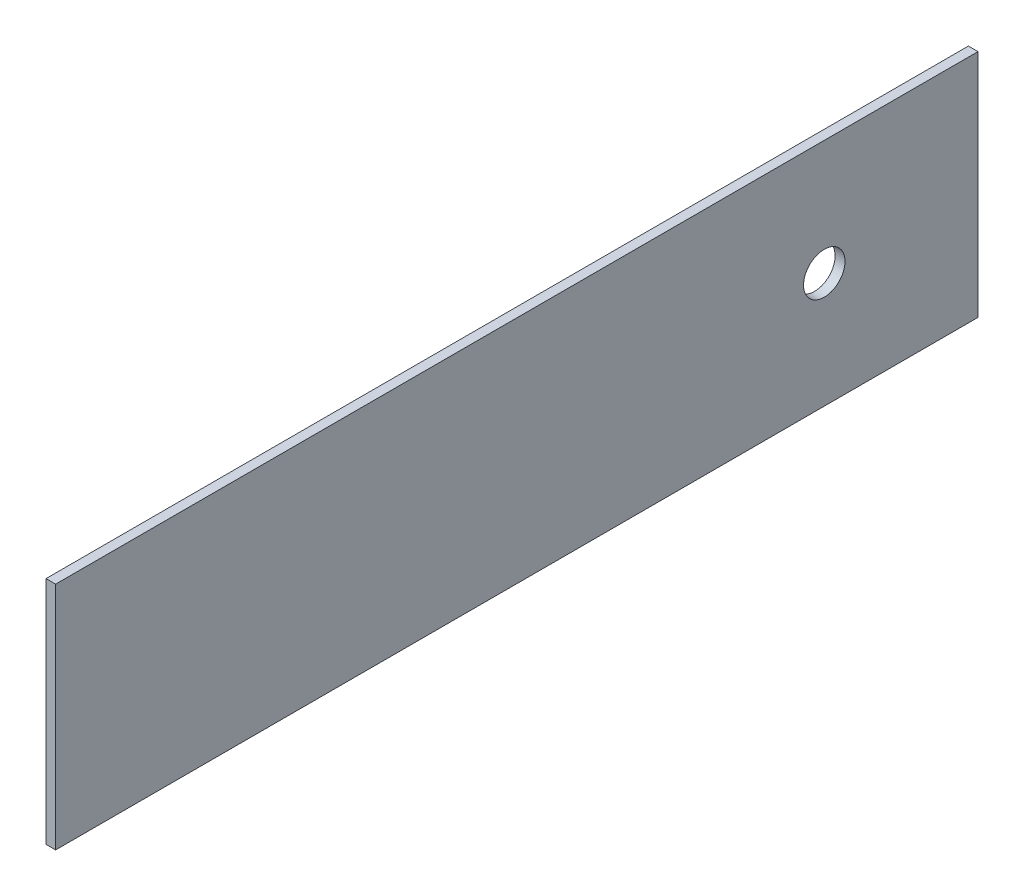
ISO-10303-21;
HEADER;
FILE_DESCRIPTION(('STEP AP214'),'2;1');
FILE_NAME('part.step','',(''),(''),'','','');
FILE_SCHEMA(('AUTOMOTIVE_DESIGN { 1 0 10303 214 1 1 1 1 }'));
ENDSEC;
DATA;
#1=APPLICATION_CONTEXT('core data for automotive mechanical design processes');
#2=APPLICATION_PROTOCOL_DEFINITION('international standard','automotive_design',2000,#1);
#3=PRODUCT_CONTEXT('',#1,'mechanical');
#4=PRODUCT('Part','Part','',(#3));
#5=PRODUCT_RELATED_PRODUCT_CATEGORY('part','',(#4));
#6=PRODUCT_DEFINITION_FORMATION('','',#4);
#7=PRODUCT_DEFINITION_CONTEXT('part definition',#1,'design');
#8=PRODUCT_DEFINITION('design','',#6,#7);
#9=PRODUCT_DEFINITION_SHAPE('','',#8);
#10=(LENGTH_UNIT() NAMED_UNIT(*) SI_UNIT(.MILLI.,.METRE.));
#11=(NAMED_UNIT(*) PLANE_ANGLE_UNIT() SI_UNIT($,.RADIAN.));
#12=(NAMED_UNIT(*) SI_UNIT($,.STERADIAN.) SOLID_ANGLE_UNIT());
#13=UNCERTAINTY_MEASURE_WITH_UNIT(LENGTH_MEASURE(1.E-05),#10,'distance_accuracy_value','');
#14=(GEOMETRIC_REPRESENTATION_CONTEXT(3) GLOBAL_UNCERTAINTY_ASSIGNED_CONTEXT((#13)) GLOBAL_UNIT_ASSIGNED_CONTEXT((#10,
#11,#12)) REPRESENTATION_CONTEXT('',''));
#15=CARTESIAN_POINT('',(0.,0.,0.));
#16=DIRECTION('',(0.,0.,1.));
#17=DIRECTION('',(1.,0.,0.));
#18=AXIS2_PLACEMENT_3D('',#15,#16,#17);
#19=CARTESIAN_POINT('',(3.175,0.,0.));
#20=DIRECTION('',(0.,0.,-1.));
#21=DIRECTION('',(0.,1.,0.));
#22=AXIS2_PLACEMENT_3D('',#19,#20,#21);
#23=PLANE('',#22);
#24=DIRECTION('',(0.,-1.,0.));
#25=VECTOR('',#24,1.);
#26=CARTESIAN_POINT('',(0.,0.,0.));
#27=LINE('',#26,#25);
#28=CARTESIAN_POINT('',(0.,0.,0.));
#29=VERTEX_POINT('',#28);
#30=CARTESIAN_POINT('',(0.,-76.073,0.));
#31=VERTEX_POINT('',#30);
#32=EDGE_CURVE('E96',#29,#31,#27,.T.);
#33=ORIENTED_EDGE('',*,*,#32,.T.);
#34=DIRECTION('',(-1.,0.,0.));
#35=VECTOR('',#34,1.);
#36=CARTESIAN_POINT('',(3.175,-76.073,0.));
#37=LINE('',#36,#35);
#38=CARTESIAN_POINT('',(3.175,-76.073,0.));
#39=VERTEX_POINT('',#38);
#40=EDGE_CURVE('E11',#39,#31,#37,.T.);
#41=ORIENTED_EDGE('',*,*,#40,.F.);
#42=DIRECTION('',(0.,-1.,0.));
#43=VECTOR('',#42,1.);
#44=CARTESIAN_POINT('',(3.175,0.,0.));
#45=LINE('',#44,#43);
#46=CARTESIAN_POINT('',(3.175,0.,0.));
#47=VERTEX_POINT('',#46);
#48=EDGE_CURVE('E84',#47,#39,#45,.T.);
#49=ORIENTED_EDGE('',*,*,#48,.F.);
#50=DIRECTION('',(-1.,0.,0.));
#51=VECTOR('',#50,1.);
#52=CARTESIAN_POINT('',(3.175,0.,0.));
#53=LINE('',#52,#51);
#54=EDGE_CURVE('E92',#47,#29,#53,.T.);
#55=ORIENTED_EDGE('',*,*,#54,.T.);
#56=EDGE_LOOP('',(#33,#41,#49,#55));
#57=FACE_BOUND('',#56,.T.);
#58=ADVANCED_FACE('F33',(#57),#23,.F.);
#59=CARTESIAN_POINT('',(3.175,-76.073,0.));
#60=DIRECTION('',(0.,1.,0.));
#61=DIRECTION('',(0.,0.,1.));
#62=AXIS2_PLACEMENT_3D('',#59,#60,#61);
#63=PLANE('',#62);
#64=DIRECTION('',(0.,0.,-1.));
#65=VECTOR('',#64,1.);
#66=CARTESIAN_POINT('',(0.,-76.073,0.));
#67=LINE('',#66,#65);
#68=CARTESIAN_POINT('',(0.,-76.073,-304.8));
#69=VERTEX_POINT('',#68);
#70=EDGE_CURVE('E88',#31,#69,#67,.T.);
#71=ORIENTED_EDGE('',*,*,#70,.T.);
#72=DIRECTION('',(-1.,0.,0.));
#73=VECTOR('',#72,1.);
#74=CARTESIAN_POINT('',(3.175,-76.073,-304.8));
#75=LINE('',#74,#73);
#76=CARTESIAN_POINT('',(3.175,-76.073,-304.8));
#77=VERTEX_POINT('',#76);
#78=EDGE_CURVE('E41',#77,#69,#75,.T.);
#79=ORIENTED_EDGE('',*,*,#78,.F.);
#80=DIRECTION('',(0.,0.,-1.));
#81=VECTOR('',#80,1.);
#82=CARTESIAN_POINT('',(3.175,-76.073,0.));
#83=LINE('',#82,#81);
#84=EDGE_CURVE('E79',#39,#77,#83,.T.);
#85=ORIENTED_EDGE('',*,*,#84,.F.);
#86=ORIENTED_EDGE('',*,*,#40,.T.);
#87=EDGE_LOOP('',(#71,#79,#85,#86));
#88=FACE_BOUND('',#87,.T.);
#89=ADVANCED_FACE('F87',(#88),#63,.F.);
#90=CARTESIAN_POINT('',(3.175,0.,-304.8));
#91=DIRECTION('',(0.,0.,1.));
#92=DIRECTION('',(1.,0.,0.));
#93=AXIS2_PLACEMENT_3D('',#90,#91,#92);
#94=PLANE('',#93);
#95=DIRECTION('',(0.,1.,0.));
#96=VECTOR('',#95,1.);
#97=CARTESIAN_POINT('',(0.,0.,-304.8));
#98=LINE('',#97,#96);
#99=CARTESIAN_POINT('',(0.,0.,-304.8));
#100=VERTEX_POINT('',#99);
#101=EDGE_CURVE('E66',#69,#100,#98,.T.);
#102=ORIENTED_EDGE('',*,*,#101,.T.);
#103=DIRECTION('',(-1.,0.,0.));
#104=VECTOR('',#103,1.);
#105=CARTESIAN_POINT('',(3.175,0.,-304.8));
#106=LINE('',#105,#104);
#107=CARTESIAN_POINT('',(3.175,0.,-304.8));
#108=VERTEX_POINT('',#107);
#109=EDGE_CURVE('E89',#108,#100,#106,.T.);
#110=ORIENTED_EDGE('',*,*,#109,.F.);
#111=DIRECTION('',(0.,1.,0.));
#112=VECTOR('',#111,1.);
#113=CARTESIAN_POINT('',(3.175,0.,-304.8));
#114=LINE('',#113,#112);
#115=EDGE_CURVE('E82',#77,#108,#114,.T.);
#116=ORIENTED_EDGE('',*,*,#115,.F.);
#117=ORIENTED_EDGE('',*,*,#78,.T.);
#118=EDGE_LOOP('',(#102,#110,#116,#117));
#119=FACE_BOUND('',#118,.T.);
#120=ADVANCED_FACE('F90',(#119),#94,.F.);
#121=CARTESIAN_POINT('',(3.175,0.,0.));
#122=DIRECTION('',(0.,-1.,0.));
#123=DIRECTION('',(0.,0.,-1.));
#124=AXIS2_PLACEMENT_3D('',#121,#122,#123);
#125=PLANE('',#124);
#126=DIRECTION('',(0.,0.,1.));
#127=VECTOR('',#126,1.);
#128=CARTESIAN_POINT('',(0.,0.,0.));
#129=LINE('',#128,#127);
#130=EDGE_CURVE('E72',#100,#29,#129,.T.);
#131=ORIENTED_EDGE('',*,*,#130,.T.);
#132=ORIENTED_EDGE('',*,*,#54,.F.);
#133=DIRECTION('',(0.,0.,1.));
#134=VECTOR('',#133,1.);
#135=CARTESIAN_POINT('',(3.175,0.,0.));
#136=LINE('',#135,#134);
#137=EDGE_CURVE('E49',#108,#47,#136,.T.);
#138=ORIENTED_EDGE('',*,*,#137,.F.);
#139=ORIENTED_EDGE('',*,*,#109,.T.);
#140=EDGE_LOOP('',(#131,#132,#138,#139));
#141=FACE_BOUND('',#140,.T.);
#142=ADVANCED_FACE('F104',(#141),#125,.F.);
#143=CARTESIAN_POINT('',(3.175,0.,0.));
#144=DIRECTION('',(1.,0.,0.));
#145=DIRECTION('',(0.,0.,-1.));
#146=AXIS2_PLACEMENT_3D('',#143,#144,#145);
#147=PLANE('',#146);
#148=CARTESIAN_POINT('',(3.175,-38.0365,-254.));
#149=DIRECTION('',(1.,0.,0.));
#150=DIRECTION('',(0.,0.,-1.));
#151=AXIS2_PLACEMENT_3D('',#148,#149,#150);
#152=CIRCLE('',#151,6.8545837);
#153=CARTESIAN_POINT('',(3.175,-38.0365,-260.8545837));
#154=VERTEX_POINT('',#153);
#155=EDGE_CURVE('E112',#154,#154,#152,.T.);
#156=ORIENTED_EDGE('',*,*,#155,.F.);
#157=EDGE_LOOP('',(#156));
#158=FACE_BOUND('',#157,.T.);
#159=ORIENTED_EDGE('',*,*,#48,.T.);
#160=ORIENTED_EDGE('',*,*,#84,.T.);
#161=ORIENTED_EDGE('',*,*,#115,.T.);
#162=ORIENTED_EDGE('',*,*,#137,.T.);
#163=EDGE_LOOP('',(#159,#160,#161,#162));
#164=FACE_BOUND('',#163,.T.);
#165=ADVANCED_FACE('F80',(#158,#164),#147,.T.);
#166=CARTESIAN_POINT('',(0.,0.,0.));
#167=DIRECTION('',(1.,0.,0.));
#168=DIRECTION('',(0.,0.,-1.));
#169=AXIS2_PLACEMENT_3D('',#166,#167,#168);
#170=PLANE('',#169);
#171=CARTESIAN_POINT('',(0.,-38.0365,-254.));
#172=DIRECTION('',(1.,0.,0.));
#173=DIRECTION('',(0.,0.,-1.));
#174=AXIS2_PLACEMENT_3D('',#171,#172,#173);
#175=CIRCLE('',#174,6.75951994813356);
#176=CARTESIAN_POINT('',(0.,-38.0365,-260.759519948134));
#177=VERTEX_POINT('',#176);
#178=EDGE_CURVE('E99',#177,#177,#175,.T.);
#179=ORIENTED_EDGE('',*,*,#178,.T.);
#180=EDGE_LOOP('',(#179));
#181=FACE_BOUND('',#180,.T.);
#182=ORIENTED_EDGE('',*,*,#32,.F.);
#183=ORIENTED_EDGE('',*,*,#130,.F.);
#184=ORIENTED_EDGE('',*,*,#101,.F.);
#185=ORIENTED_EDGE('',*,*,#70,.F.);
#186=EDGE_LOOP('',(#182,#183,#184,#185));
#187=FACE_BOUND('',#186,.T.);
#188=ADVANCED_FACE('F107',(#181,#187),#170,.F.);
#189=CARTESIAN_POINT('',(3.175,-38.0365,-254.));
#190=DIRECTION('',(1.,0.,0.));
#191=DIRECTION('',(0.,0.,-1.));
#192=AXIS2_PLACEMENT_3D('',#189,#190,#191);
#193=CONICAL_SURFACE('',#192,6.8545837,0.0299323966717032);
#194=ORIENTED_EDGE('',*,*,#155,.T.);
#195=EDGE_LOOP('',(#194));
#196=FACE_BOUND('',#195,.T.);
#197=ORIENTED_EDGE('',*,*,#178,.F.);
#198=EDGE_LOOP('',(#197));
#199=FACE_BOUND('',#198,.T.);
#200=ADVANCED_FACE('F116',(#196,#199),#193,.F.);
#201=CLOSED_SHELL('',(#58,#89,#120,#142,#165,#188,#200));
#202=MANIFOLD_SOLID_BREP('B2',#201);
#203=ADVANCED_BREP_SHAPE_REPRESENTATION('',(#18,#202),#14);
#204=SHAPE_DEFINITION_REPRESENTATION(#9,#203);
ENDSEC;
END-ISO-10303-21;
